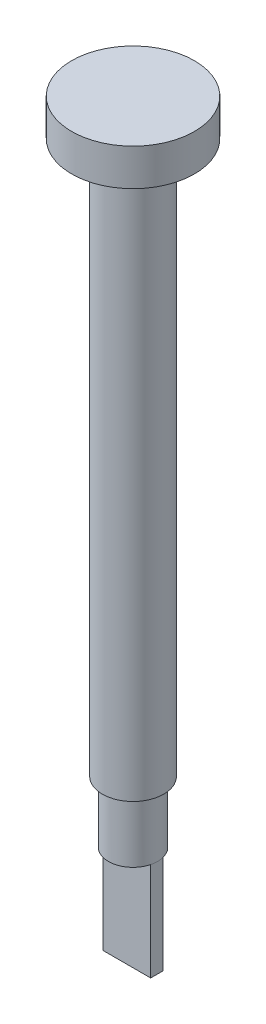
ISO-10303-21;
HEADER;
FILE_DESCRIPTION(('STEP AP214'),'2;1');
FILE_NAME('part.step','',(''),(''),'','','');
FILE_SCHEMA(('AUTOMOTIVE_DESIGN { 1 0 10303 214 1 1 1 1 }'));
ENDSEC;
DATA;
#1=APPLICATION_CONTEXT('core data for automotive mechanical design processes');
#2=APPLICATION_PROTOCOL_DEFINITION('international standard','automotive_design',2000,#1);
#3=PRODUCT_CONTEXT('',#1,'mechanical');
#4=PRODUCT('Part','Part','',(#3));
#5=PRODUCT_RELATED_PRODUCT_CATEGORY('part','',(#4));
#6=PRODUCT_DEFINITION_FORMATION('','',#4);
#7=PRODUCT_DEFINITION_CONTEXT('part definition',#1,'design');
#8=PRODUCT_DEFINITION('design','',#6,#7);
#9=PRODUCT_DEFINITION_SHAPE('','',#8);
#10=(LENGTH_UNIT() NAMED_UNIT(*) SI_UNIT(.MILLI.,.METRE.));
#11=(NAMED_UNIT(*) PLANE_ANGLE_UNIT() SI_UNIT($,.RADIAN.));
#12=(NAMED_UNIT(*) SI_UNIT($,.STERADIAN.) SOLID_ANGLE_UNIT());
#13=UNCERTAINTY_MEASURE_WITH_UNIT(LENGTH_MEASURE(1.E-05),#10,'distance_accuracy_value','');
#14=(GEOMETRIC_REPRESENTATION_CONTEXT(3) GLOBAL_UNCERTAINTY_ASSIGNED_CONTEXT((#13)) GLOBAL_UNIT_ASSIGNED_CONTEXT((#10,
#11,#12)) REPRESENTATION_CONTEXT('',''));
#15=CARTESIAN_POINT('',(0.,0.,0.));
#16=DIRECTION('',(0.,0.,1.));
#17=DIRECTION('',(1.,0.,0.));
#18=AXIS2_PLACEMENT_3D('',#15,#16,#17);
#19=CARTESIAN_POINT('',(0.,0.,0.));
#20=DIRECTION('',(0.,-1.,0.));
#21=DIRECTION('',(0.,0.,-1.));
#22=AXIS2_PLACEMENT_3D('',#19,#20,#21);
#23=PLANE('',#22);
#24=DIRECTION('',(0.,0.,-1.));
#25=VECTOR('',#24,1.);
#26=CARTESIAN_POINT('',(-1.93649167310371,0.,0.5));
#27=LINE('',#26,#25);
#28=CARTESIAN_POINT('',(-1.93649167310371,0.,0.5));
#29=VERTEX_POINT('',#28);
#30=CARTESIAN_POINT('',(-1.93649167310371,0.,-0.5));
#31=VERTEX_POINT('',#30);
#32=EDGE_CURVE('E62',#29,#31,#27,.T.);
#33=ORIENTED_EDGE('',*,*,#32,.F.);
#34=CARTESIAN_POINT('',(0.,0.,0.));
#35=DIRECTION('',(0.,-1.,0.));
#36=DIRECTION('',(0.,0.,-1.));
#37=AXIS2_PLACEMENT_3D('',#34,#35,#36);
#38=CIRCLE('',#37,2.);
#39=EDGE_CURVE('E124',#29,#31,#38,.T.);
#40=ORIENTED_EDGE('',*,*,#39,.T.);
#41=EDGE_LOOP('',(#33,#40));
#42=FACE_BOUND('',#41,.T.);
#43=ADVANCED_FACE('F39',(#42),#23,.T.);
#44=DIRECTION('',(-1.,0.,0.));
#45=VECTOR('',#44,1.);
#46=CARTESIAN_POINT('',(-1.93649167310371,0.,0.5));
#47=LINE('',#46,#45);
#48=CARTESIAN_POINT('',(1.93649167310371,0.,0.499999999999999));
#49=VERTEX_POINT('',#48);
#50=EDGE_CURVE('E105',#49,#29,#47,.T.);
#51=ORIENTED_EDGE('',*,*,#50,.F.);
#52=EDGE_CURVE('E50',#49,#29,#38,.T.);
#53=ORIENTED_EDGE('',*,*,#52,.T.);
#54=EDGE_LOOP('',(#51,#53));
#55=FACE_BOUND('',#54,.T.);
#56=ADVANCED_FACE('F132',(#55),#23,.T.);
#57=DIRECTION('',(0.,0.,1.));
#58=VECTOR('',#57,1.);
#59=CARTESIAN_POINT('',(1.93649167310371,0.,0.5));
#60=LINE('',#59,#58);
#61=CARTESIAN_POINT('',(1.93649167310371,0.,-0.5));
#62=VERTEX_POINT('',#61);
#63=EDGE_CURVE('E138',#62,#49,#60,.T.);
#64=ORIENTED_EDGE('',*,*,#63,.F.);
#65=EDGE_CURVE('E11',#62,#49,#38,.T.);
#66=ORIENTED_EDGE('',*,*,#65,.T.);
#67=EDGE_LOOP('',(#64,#66));
#68=FACE_BOUND('',#67,.T.);
#69=ADVANCED_FACE('F147',(#68),#23,.T.);
#70=DIRECTION('',(1.,0.,0.));
#71=VECTOR('',#70,1.);
#72=CARTESIAN_POINT('',(-1.93649167310371,0.,-0.5));
#73=LINE('',#72,#71);
#74=EDGE_CURVE('E53',#31,#62,#73,.T.);
#75=ORIENTED_EDGE('',*,*,#74,.F.);
#76=EDGE_CURVE('E48',#31,#62,#38,.T.);
#77=ORIENTED_EDGE('',*,*,#76,.T.);
#78=EDGE_LOOP('',(#75,#77));
#79=FACE_BOUND('',#78,.T.);
#80=ADVANCED_FACE('F41',(#79),#23,.T.);
#81=CARTESIAN_POINT('',(0.,0.,0.));
#82=DIRECTION('',(0.,-1.,0.));
#83=DIRECTION('',(0.,0.,-1.));
#84=AXIS2_PLACEMENT_3D('',#81,#82,#83);
#85=CYLINDRICAL_SURFACE('',#84,2.);
#86=CARTESIAN_POINT('',(0.,5.,0.));
#87=DIRECTION('',(0.,-1.,0.));
#88=DIRECTION('',(0.,0.,-1.));
#89=AXIS2_PLACEMENT_3D('',#86,#87,#88);
#90=CIRCLE('',#89,2.);
#91=CARTESIAN_POINT('',(0.,5.,-2.));
#92=VERTEX_POINT('',#91);
#93=EDGE_CURVE('E121',#92,#92,#90,.T.);
#94=ORIENTED_EDGE('',*,*,#93,.T.);
#95=EDGE_LOOP('',(#94));
#96=FACE_BOUND('',#95,.T.);
#97=ORIENTED_EDGE('',*,*,#65,.F.);
#98=ORIENTED_EDGE('',*,*,#76,.F.);
#99=ORIENTED_EDGE('',*,*,#39,.F.);
#100=ORIENTED_EDGE('',*,*,#52,.F.);
#101=EDGE_LOOP('',(#97,#98,#99,#100));
#102=FACE_BOUND('',#101,.T.);
#103=ADVANCED_FACE('F151',(#96,#102),#85,.T.);
#104=CARTESIAN_POINT('',(2.,5.,0.));
#105=DIRECTION('',(0.,-1.,0.));
#106=DIRECTION('',(0.,0.,-1.));
#107=AXIS2_PLACEMENT_3D('',#104,#105,#106);
#108=PLANE('',#107);
#109=CARTESIAN_POINT('',(0.,5.,0.));
#110=DIRECTION('',(0.,-1.,0.));
#111=DIRECTION('',(0.,0.,-1.));
#112=AXIS2_PLACEMENT_3D('',#109,#110,#111);
#113=CIRCLE('',#112,2.5);
#114=CARTESIAN_POINT('',(0.,5.,-2.5));
#115=VERTEX_POINT('',#114);
#116=EDGE_CURVE('E116',#115,#115,#113,.T.);
#117=ORIENTED_EDGE('',*,*,#116,.T.);
#118=EDGE_LOOP('',(#117));
#119=FACE_BOUND('',#118,.T.);
#120=ORIENTED_EDGE('',*,*,#93,.F.);
#121=EDGE_LOOP('',(#120));
#122=FACE_BOUND('',#121,.T.);
#123=ADVANCED_FACE('F153',(#119,#122),#108,.T.);
#124=CARTESIAN_POINT('',(0.,0.,0.));
#125=DIRECTION('',(0.,-1.,0.));
#126=DIRECTION('',(0.,0.,-1.));
#127=AXIS2_PLACEMENT_3D('',#124,#125,#126);
#128=CYLINDRICAL_SURFACE('',#127,2.5);
#129=CARTESIAN_POINT('',(0.,50.,0.));
#130=DIRECTION('',(0.,-1.,0.));
#131=DIRECTION('',(0.,0.,-1.));
#132=AXIS2_PLACEMENT_3D('',#129,#130,#131);
#133=CIRCLE('',#132,2.5);
#134=CARTESIAN_POINT('',(0.,50.,-2.5));
#135=VERTEX_POINT('',#134);
#136=EDGE_CURVE('E117',#135,#135,#133,.T.);
#137=ORIENTED_EDGE('',*,*,#136,.T.);
#138=EDGE_LOOP('',(#137));
#139=FACE_BOUND('',#138,.T.);
#140=ORIENTED_EDGE('',*,*,#116,.F.);
#141=EDGE_LOOP('',(#140));
#142=FACE_BOUND('',#141,.T.);
#143=ADVANCED_FACE('F157',(#139,#142),#128,.T.);
#144=CARTESIAN_POINT('',(5.,50.,0.));
#145=DIRECTION('',(0.,-1.,0.));
#146=DIRECTION('',(0.,0.,-1.));
#147=AXIS2_PLACEMENT_3D('',#144,#145,#146);
#148=PLANE('',#147);
#149=CARTESIAN_POINT('',(0.,50.,0.));
#150=DIRECTION('',(0.,-1.,0.));
#151=DIRECTION('',(0.,0.,-1.));
#152=AXIS2_PLACEMENT_3D('',#149,#150,#151);
#153=CIRCLE('',#152,5.);
#154=CARTESIAN_POINT('',(0.,50.,-5.));
#155=VERTEX_POINT('',#154);
#156=EDGE_CURVE('E107',#155,#155,#153,.T.);
#157=ORIENTED_EDGE('',*,*,#156,.T.);
#158=EDGE_LOOP('',(#157));
#159=FACE_BOUND('',#158,.T.);
#160=ORIENTED_EDGE('',*,*,#136,.F.);
#161=EDGE_LOOP('',(#160));
#162=FACE_BOUND('',#161,.T.);
#163=ADVANCED_FACE('F196',(#159,#162),#148,.T.);
#164=CARTESIAN_POINT('',(0.,0.,0.));
#165=DIRECTION('',(0.,-1.,0.));
#166=DIRECTION('',(0.,0.,-1.));
#167=AXIS2_PLACEMENT_3D('',#164,#165,#166);
#168=CYLINDRICAL_SURFACE('',#167,5.);
#169=CARTESIAN_POINT('',(0.,53.,0.));
#170=DIRECTION('',(0.,-1.,0.));
#171=DIRECTION('',(0.,0.,-1.));
#172=AXIS2_PLACEMENT_3D('',#169,#170,#171);
#173=CIRCLE('',#172,5.);
#174=CARTESIAN_POINT('',(0.,53.,-5.));
#175=VERTEX_POINT('',#174);
#176=EDGE_CURVE('E104',#175,#175,#173,.T.);
#177=ORIENTED_EDGE('',*,*,#176,.T.);
#178=EDGE_LOOP('',(#177));
#179=FACE_BOUND('',#178,.T.);
#180=ORIENTED_EDGE('',*,*,#156,.F.);
#181=EDGE_LOOP('',(#180));
#182=FACE_BOUND('',#181,.T.);
#183=ADVANCED_FACE('F208',(#179,#182),#168,.T.);
#184=CARTESIAN_POINT('',(0.,53.,0.));
#185=DIRECTION('',(0.,1.,0.));
#186=DIRECTION('',(0.,0.,1.));
#187=AXIS2_PLACEMENT_3D('',#184,#185,#186);
#188=PLANE('',#187);
#189=ORIENTED_EDGE('',*,*,#176,.F.);
#190=EDGE_LOOP('',(#189));
#191=FACE_BOUND('',#190,.T.);
#192=ADVANCED_FACE('F217',(#191),#188,.T.);
#193=CARTESIAN_POINT('',(-1.93649167310371,-8.,0.5));
#194=DIRECTION('',(1.,0.,0.));
#195=DIRECTION('',(0.,0.,-1.));
#196=AXIS2_PLACEMENT_3D('',#193,#194,#195);
#197=PLANE('',#196);
#198=ORIENTED_EDGE('',*,*,#32,.T.);
#199=DIRECTION('',(0.,1.,0.));
#200=VECTOR('',#199,1.);
#201=CARTESIAN_POINT('',(-1.93649167310371,-8.,-0.5));
#202=LINE('',#201,#200);
#203=CARTESIAN_POINT('',(-1.93649167310371,-8.,-0.5));
#204=VERTEX_POINT('',#203);
#205=EDGE_CURVE('E87',#204,#31,#202,.T.);
#206=ORIENTED_EDGE('',*,*,#205,.F.);
#207=DIRECTION('',(0.,0.,-1.));
#208=VECTOR('',#207,1.);
#209=CARTESIAN_POINT('',(-1.93649167310371,-8.,0.5));
#210=LINE('',#209,#208);
#211=CARTESIAN_POINT('',(-1.93649167310371,-8.,0.5));
#212=VERTEX_POINT('',#211);
#213=EDGE_CURVE('E91',#212,#204,#210,.T.);
#214=ORIENTED_EDGE('',*,*,#213,.F.);
#215=DIRECTION('',(0.,1.,0.));
#216=VECTOR('',#215,1.);
#217=CARTESIAN_POINT('',(-1.93649167310371,-8.,0.5));
#218=LINE('',#217,#216);
#219=EDGE_CURVE('E136',#212,#29,#218,.T.);
#220=ORIENTED_EDGE('',*,*,#219,.T.);
#221=EDGE_LOOP('',(#198,#206,#214,#220));
#222=FACE_BOUND('',#221,.T.);
#223=ADVANCED_FACE('F102',(#222),#197,.F.);
#224=CARTESIAN_POINT('',(-1.93649167310371,-8.,-0.5));
#225=DIRECTION('',(0.,0.,1.));
#226=DIRECTION('',(1.,0.,0.));
#227=AXIS2_PLACEMENT_3D('',#224,#225,#226);
#228=PLANE('',#227);
#229=ORIENTED_EDGE('',*,*,#74,.T.);
#230=DIRECTION('',(0.,1.,0.));
#231=VECTOR('',#230,1.);
#232=CARTESIAN_POINT('',(1.93649167310371,-8.,-0.5));
#233=LINE('',#232,#231);
#234=CARTESIAN_POINT('',(1.93649167310371,-8.,-0.5));
#235=VERTEX_POINT('',#234);
#236=EDGE_CURVE('E90',#235,#62,#233,.T.);
#237=ORIENTED_EDGE('',*,*,#236,.F.);
#238=DIRECTION('',(1.,0.,0.));
#239=VECTOR('',#238,1.);
#240=CARTESIAN_POINT('',(-1.93649167310371,-8.,-0.5));
#241=LINE('',#240,#239);
#242=EDGE_CURVE('E83',#204,#235,#241,.T.);
#243=ORIENTED_EDGE('',*,*,#242,.F.);
#244=ORIENTED_EDGE('',*,*,#205,.T.);
#245=EDGE_LOOP('',(#229,#237,#243,#244));
#246=FACE_BOUND('',#245,.T.);
#247=ADVANCED_FACE('F84',(#246),#228,.F.);
#248=CARTESIAN_POINT('',(1.93649167310371,-8.,0.5));
#249=DIRECTION('',(-1.,0.,0.));
#250=DIRECTION('',(0.,0.,1.));
#251=AXIS2_PLACEMENT_3D('',#248,#249,#250);
#252=PLANE('',#251);
#253=ORIENTED_EDGE('',*,*,#63,.T.);
#254=DIRECTION('',(0.,1.,0.));
#255=VECTOR('',#254,1.);
#256=CARTESIAN_POINT('',(1.93649167310371,-8.,0.5));
#257=LINE('',#256,#255);
#258=CARTESIAN_POINT('',(1.93649167310371,-8.,0.5));
#259=VERTEX_POINT('',#258);
#260=EDGE_CURVE('E109',#259,#49,#257,.T.);
#261=ORIENTED_EDGE('',*,*,#260,.F.);
#262=DIRECTION('',(0.,0.,1.));
#263=VECTOR('',#262,1.);
#264=CARTESIAN_POINT('',(1.93649167310371,-8.,0.5));
#265=LINE('',#264,#263);
#266=EDGE_CURVE('E95',#235,#259,#265,.T.);
#267=ORIENTED_EDGE('',*,*,#266,.F.);
#268=ORIENTED_EDGE('',*,*,#236,.T.);
#269=EDGE_LOOP('',(#253,#261,#267,#268));
#270=FACE_BOUND('',#269,.T.);
#271=ADVANCED_FACE('F146',(#270),#252,.F.);
#272=CARTESIAN_POINT('',(-1.93649167310371,-8.,0.5));
#273=DIRECTION('',(0.,0.,-1.));
#274=DIRECTION('',(-1.,0.,0.));
#275=AXIS2_PLACEMENT_3D('',#272,#273,#274);
#276=PLANE('',#275);
#277=ORIENTED_EDGE('',*,*,#50,.T.);
#278=ORIENTED_EDGE('',*,*,#219,.F.);
#279=DIRECTION('',(-1.,0.,0.));
#280=VECTOR('',#279,1.);
#281=CARTESIAN_POINT('',(-1.93649167310371,-8.,0.5));
#282=LINE('',#281,#280);
#283=EDGE_CURVE('E98',#259,#212,#282,.T.);
#284=ORIENTED_EDGE('',*,*,#283,.F.);
#285=ORIENTED_EDGE('',*,*,#260,.T.);
#286=EDGE_LOOP('',(#277,#278,#284,#285));
#287=FACE_BOUND('',#286,.T.);
#288=ADVANCED_FACE('F133',(#287),#276,.F.);
#289=CARTESIAN_POINT('',(0.,-8.,0.));
#290=DIRECTION('',(0.,-1.,0.));
#291=DIRECTION('',(0.,0.,-1.));
#292=AXIS2_PLACEMENT_3D('',#289,#290,#291);
#293=PLANE('',#292);
#294=ORIENTED_EDGE('',*,*,#213,.T.);
#295=ORIENTED_EDGE('',*,*,#242,.T.);
#296=ORIENTED_EDGE('',*,*,#266,.T.);
#297=ORIENTED_EDGE('',*,*,#283,.T.);
#298=EDGE_LOOP('',(#294,#295,#296,#297));
#299=FACE_BOUND('',#298,.T.);
#300=ADVANCED_FACE('F96',(#299),#293,.T.);
#301=CLOSED_SHELL('',(#43,#56,#69,#80,#103,#123,#143,#163,#183,#192,#223,#247,#271,#288,#300));
#302=MANIFOLD_SOLID_BREP('B2',#301);
#303=ADVANCED_BREP_SHAPE_REPRESENTATION('',(#18,#302),#14);
#304=SHAPE_DEFINITION_REPRESENTATION(#9,#303);
ENDSEC;
END-ISO-10303-21;
